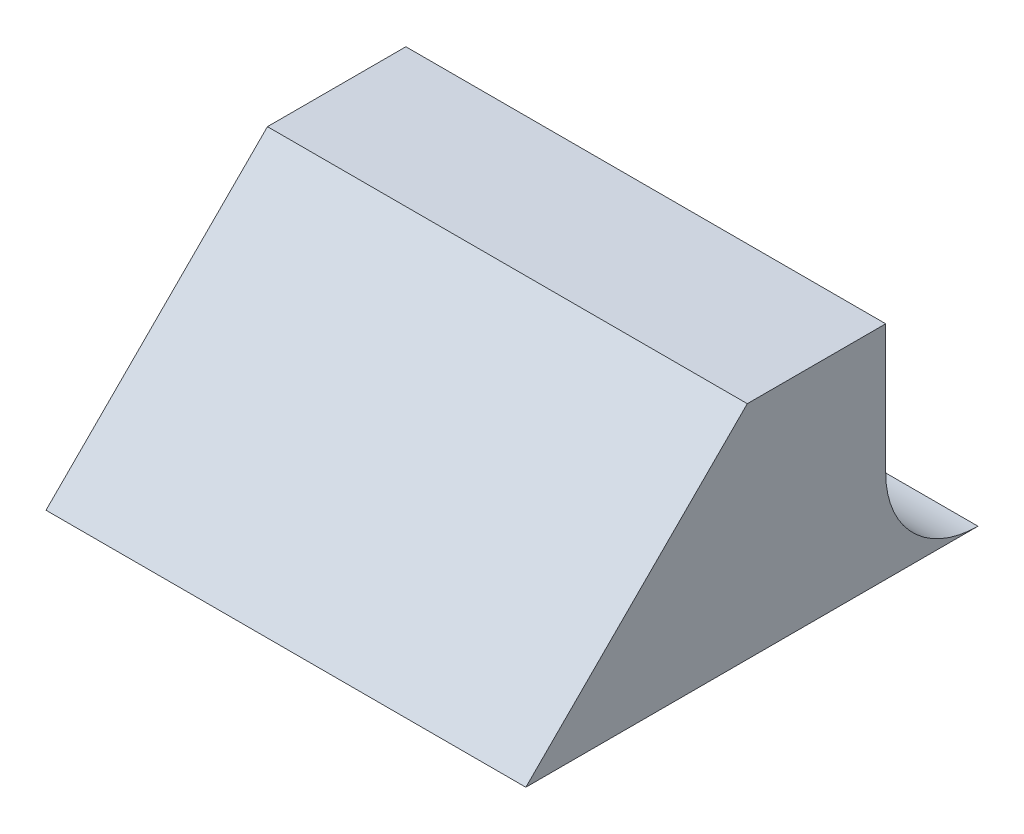
ISO-10303-21;
HEADER;
FILE_DESCRIPTION(('STEP AP214'),'2;1');
FILE_NAME('part.step','',(''),(''),'','','');
FILE_SCHEMA(('AUTOMOTIVE_DESIGN { 1 0 10303 214 1 1 1 1 }'));
ENDSEC;
DATA;
#1=APPLICATION_CONTEXT('core data for automotive mechanical design processes');
#2=APPLICATION_PROTOCOL_DEFINITION('international standard','automotive_design',2000,#1);
#3=PRODUCT_CONTEXT('',#1,'mechanical');
#4=PRODUCT('Part','Part','',(#3));
#5=PRODUCT_RELATED_PRODUCT_CATEGORY('part','',(#4));
#6=PRODUCT_DEFINITION_FORMATION('','',#4);
#7=PRODUCT_DEFINITION_CONTEXT('part definition',#1,'design');
#8=PRODUCT_DEFINITION('design','',#6,#7);
#9=PRODUCT_DEFINITION_SHAPE('','',#8);
#10=(LENGTH_UNIT() NAMED_UNIT(*) SI_UNIT(.MILLI.,.METRE.));
#11=(NAMED_UNIT(*) PLANE_ANGLE_UNIT() SI_UNIT($,.RADIAN.));
#12=(NAMED_UNIT(*) SI_UNIT($,.STERADIAN.) SOLID_ANGLE_UNIT());
#13=UNCERTAINTY_MEASURE_WITH_UNIT(LENGTH_MEASURE(1.E-05),#10,'distance_accuracy_value','');
#14=(GEOMETRIC_REPRESENTATION_CONTEXT(3) GLOBAL_UNCERTAINTY_ASSIGNED_CONTEXT((#13)) GLOBAL_UNIT_ASSIGNED_CONTEXT((#10,
#11,#12)) REPRESENTATION_CONTEXT('',''));
#15=CARTESIAN_POINT('',(0.,0.,0.));
#16=DIRECTION('',(0.,0.,1.));
#17=DIRECTION('',(1.,0.,0.));
#18=AXIS2_PLACEMENT_3D('',#15,#16,#17);
#19=CARTESIAN_POINT('',(-1.3,0.,0.));
#20=DIRECTION('',(1.,0.,0.));
#21=DIRECTION('',(0.,1.,0.));
#22=AXIS2_PLACEMENT_3D('',#19,#20,#21);
#23=PLANE('',#22);
#24=DIRECTION('',(0.,-0.707106781186548,0.707106781186548));
#25=VECTOR('',#24,1.);
#26=CARTESIAN_POINT('',(-1.3,3.135,3.2));
#27=LINE('',#26,#25);
#28=CARTESIAN_POINT('',(-1.3,3.135,3.2));
#29=VERTEX_POINT('',#28);
#30=CARTESIAN_POINT('',(-1.3,1.935,4.4));
#31=VERTEX_POINT('',#30);
#32=EDGE_CURVE('E11',#29,#31,#27,.T.);
#33=ORIENTED_EDGE('',*,*,#32,.F.);
#34=DIRECTION('',(0.,0.,1.));
#35=VECTOR('',#34,1.);
#36=CARTESIAN_POINT('',(-1.3,3.135,2.45));
#37=LINE('',#36,#35);
#38=CARTESIAN_POINT('',(-1.3,3.135,2.45));
#39=VERTEX_POINT('',#38);
#40=EDGE_CURVE('E24',#39,#29,#37,.T.);
#41=ORIENTED_EDGE('',*,*,#40,.F.);
#42=DIRECTION('',(0.,1.,0.));
#43=VECTOR('',#42,1.);
#44=CARTESIAN_POINT('',(-1.3,2.435,2.45));
#45=LINE('',#44,#43);
#46=CARTESIAN_POINT('',(-1.3,2.435,2.45));
#47=VERTEX_POINT('',#46);
#48=EDGE_CURVE('E103',#47,#39,#45,.T.);
#49=ORIENTED_EDGE('',*,*,#48,.F.);
#50=CARTESIAN_POINT('',(-1.3,2.435,1.95));
#51=DIRECTION('',(-1.,0.,0.));
#52=DIRECTION('',(0.,-1.,0.));
#53=AXIS2_PLACEMENT_3D('',#50,#51,#52);
#54=CIRCLE('',#53,0.5);
#55=CARTESIAN_POINT('',(-1.3,1.935,1.95));
#56=VERTEX_POINT('',#55);
#57=EDGE_CURVE('E78',#56,#47,#54,.T.);
#58=ORIENTED_EDGE('',*,*,#57,.F.);
#59=DIRECTION('',(0.,0.,-1.));
#60=VECTOR('',#59,1.);
#61=CARTESIAN_POINT('',(-1.3,1.935,4.4));
#62=LINE('',#61,#60);
#63=EDGE_CURVE('E99',#31,#56,#62,.T.);
#64=ORIENTED_EDGE('',*,*,#63,.F.);
#65=EDGE_LOOP('',(#33,#41,#49,#58,#64));
#66=FACE_BOUND('',#65,.T.);
#67=ADVANCED_FACE('F17',(#66),#23,.F.);
#68=CARTESIAN_POINT('',(-1.3,1.935,4.4));
#69=DIRECTION('',(0.,-1.,0.));
#70=DIRECTION('',(0.,0.,-1.));
#71=AXIS2_PLACEMENT_3D('',#68,#69,#70);
#72=PLANE('',#71);
#73=DIRECTION('',(1.,0.,0.));
#74=VECTOR('',#73,1.);
#75=CARTESIAN_POINT('',(-1.3,1.935,1.95));
#76=LINE('',#75,#74);
#77=CARTESIAN_POINT('',(1.3,1.935,1.95));
#78=VERTEX_POINT('',#77);
#79=EDGE_CURVE('E97',#56,#78,#76,.T.);
#80=ORIENTED_EDGE('',*,*,#79,.T.);
#81=DIRECTION('',(0.,0.,-1.));
#82=VECTOR('',#81,1.);
#83=CARTESIAN_POINT('',(1.3,1.935,4.4));
#84=LINE('',#83,#82);
#85=CARTESIAN_POINT('',(1.3,1.935,4.4));
#86=VERTEX_POINT('',#85);
#87=EDGE_CURVE('E83',#86,#78,#84,.T.);
#88=ORIENTED_EDGE('',*,*,#87,.F.);
#89=DIRECTION('',(1.,0.,0.));
#90=VECTOR('',#89,1.);
#91=CARTESIAN_POINT('',(-1.3,1.935,4.4));
#92=LINE('',#91,#90);
#93=EDGE_CURVE('E94',#31,#86,#92,.T.);
#94=ORIENTED_EDGE('',*,*,#93,.F.);
#95=ORIENTED_EDGE('',*,*,#63,.T.);
#96=EDGE_LOOP('',(#80,#88,#94,#95));
#97=FACE_BOUND('',#96,.T.);
#98=ADVANCED_FACE('F109',(#97),#72,.T.);
#99=CARTESIAN_POINT('',(-1.3,3.135,3.2));
#100=DIRECTION('',(0.,0.707106781186548,0.707106781186548));
#101=DIRECTION('',(1.,0.,0.));
#102=AXIS2_PLACEMENT_3D('',#99,#100,#101);
#103=PLANE('',#102);
#104=ORIENTED_EDGE('',*,*,#93,.T.);
#105=DIRECTION('',(0.,-0.707106781186548,0.707106781186548));
#106=VECTOR('',#105,1.);
#107=CARTESIAN_POINT('',(1.3,3.135,3.2));
#108=LINE('',#107,#106);
#109=CARTESIAN_POINT('',(1.3,3.135,3.2));
#110=VERTEX_POINT('',#109);
#111=EDGE_CURVE('E92',#110,#86,#108,.T.);
#112=ORIENTED_EDGE('',*,*,#111,.F.);
#113=DIRECTION('',(1.,0.,0.));
#114=VECTOR('',#113,1.);
#115=CARTESIAN_POINT('',(-1.3,3.135,3.2));
#116=LINE('',#115,#114);
#117=EDGE_CURVE('E89',#29,#110,#116,.T.);
#118=ORIENTED_EDGE('',*,*,#117,.F.);
#119=ORIENTED_EDGE('',*,*,#32,.T.);
#120=EDGE_LOOP('',(#104,#112,#118,#119));
#121=FACE_BOUND('',#120,.T.);
#122=ADVANCED_FACE('F106',(#121),#103,.T.);
#123=CARTESIAN_POINT('',(-1.3,3.135,2.45));
#124=DIRECTION('',(0.,1.,0.));
#125=DIRECTION('',(1.,0.,0.));
#126=AXIS2_PLACEMENT_3D('',#123,#124,#125);
#127=PLANE('',#126);
#128=ORIENTED_EDGE('',*,*,#117,.T.);
#129=DIRECTION('',(0.,0.,1.));
#130=VECTOR('',#129,1.);
#131=CARTESIAN_POINT('',(1.3,3.135,2.45));
#132=LINE('',#131,#130);
#133=CARTESIAN_POINT('',(1.3,3.135,2.45));
#134=VERTEX_POINT('',#133);
#135=EDGE_CURVE('E87',#134,#110,#132,.T.);
#136=ORIENTED_EDGE('',*,*,#135,.F.);
#137=DIRECTION('',(1.,0.,0.));
#138=VECTOR('',#137,1.);
#139=CARTESIAN_POINT('',(-1.3,3.135,2.45));
#140=LINE('',#139,#138);
#141=EDGE_CURVE('E67',#39,#134,#140,.T.);
#142=ORIENTED_EDGE('',*,*,#141,.F.);
#143=ORIENTED_EDGE('',*,*,#40,.T.);
#144=EDGE_LOOP('',(#128,#136,#142,#143));
#145=FACE_BOUND('',#144,.T.);
#146=ADVANCED_FACE('F105',(#145),#127,.T.);
#147=CARTESIAN_POINT('',(-1.3,2.435,2.45));
#148=DIRECTION('',(0.,0.,-1.));
#149=DIRECTION('',(0.,-1.,0.));
#150=AXIS2_PLACEMENT_3D('',#147,#148,#149);
#151=PLANE('',#150);
#152=ORIENTED_EDGE('',*,*,#141,.T.);
#153=DIRECTION('',(0.,1.,0.));
#154=VECTOR('',#153,1.);
#155=CARTESIAN_POINT('',(1.3,2.435,2.45));
#156=LINE('',#155,#154);
#157=CARTESIAN_POINT('',(1.3,2.435,2.45));
#158=VERTEX_POINT('',#157);
#159=EDGE_CURVE('E61',#158,#134,#156,.T.);
#160=ORIENTED_EDGE('',*,*,#159,.F.);
#161=DIRECTION('',(1.,0.,0.));
#162=VECTOR('',#161,1.);
#163=CARTESIAN_POINT('',(-1.3,2.435,2.45));
#164=LINE('',#163,#162);
#165=EDGE_CURVE('E65',#47,#158,#164,.T.);
#166=ORIENTED_EDGE('',*,*,#165,.F.);
#167=ORIENTED_EDGE('',*,*,#48,.T.);
#168=EDGE_LOOP('',(#152,#160,#166,#167));
#169=FACE_BOUND('',#168,.T.);
#170=ADVANCED_FACE('F63',(#169),#151,.T.);
#171=CARTESIAN_POINT('',(-1.3,2.435,1.95));
#172=DIRECTION('',(1.,0.,0.));
#173=DIRECTION('',(0.,0.,-1.));
#174=AXIS2_PLACEMENT_3D('',#171,#172,#173);
#175=CYLINDRICAL_SURFACE('',#174,0.5);
#176=ORIENTED_EDGE('',*,*,#165,.T.);
#177=CARTESIAN_POINT('',(1.3,2.435,1.95));
#178=DIRECTION('',(-1.,0.,0.));
#179=DIRECTION('',(0.,-1.,0.));
#180=AXIS2_PLACEMENT_3D('',#177,#178,#179);
#181=CIRCLE('',#180,0.5);
#182=EDGE_CURVE('E77',#78,#158,#181,.T.);
#183=ORIENTED_EDGE('',*,*,#182,.F.);
#184=ORIENTED_EDGE('',*,*,#79,.F.);
#185=ORIENTED_EDGE('',*,*,#57,.T.);
#186=EDGE_LOOP('',(#176,#183,#184,#185));
#187=FACE_BOUND('',#186,.T.);
#188=ADVANCED_FACE('F75',(#187),#175,.F.);
#189=CARTESIAN_POINT('',(1.3,0.,0.));
#190=DIRECTION('',(1.,0.,0.));
#191=DIRECTION('',(0.,1.,0.));
#192=AXIS2_PLACEMENT_3D('',#189,#190,#191);
#193=PLANE('',#192);
#194=ORIENTED_EDGE('',*,*,#182,.T.);
#195=ORIENTED_EDGE('',*,*,#159,.T.);
#196=ORIENTED_EDGE('',*,*,#135,.T.);
#197=ORIENTED_EDGE('',*,*,#111,.T.);
#198=ORIENTED_EDGE('',*,*,#87,.T.);
#199=EDGE_LOOP('',(#194,#195,#196,#197,#198));
#200=FACE_BOUND('',#199,.T.);
#201=ADVANCED_FACE('F81',(#200),#193,.T.);
#202=CLOSED_SHELL('',(#67,#98,#122,#146,#170,#188,#201));
#203=MANIFOLD_SOLID_BREP('B1',#202);
#204=ADVANCED_BREP_SHAPE_REPRESENTATION('',(#18,#203),#14);
#205=SHAPE_DEFINITION_REPRESENTATION(#9,#204);
ENDSEC;
END-ISO-10303-21;
